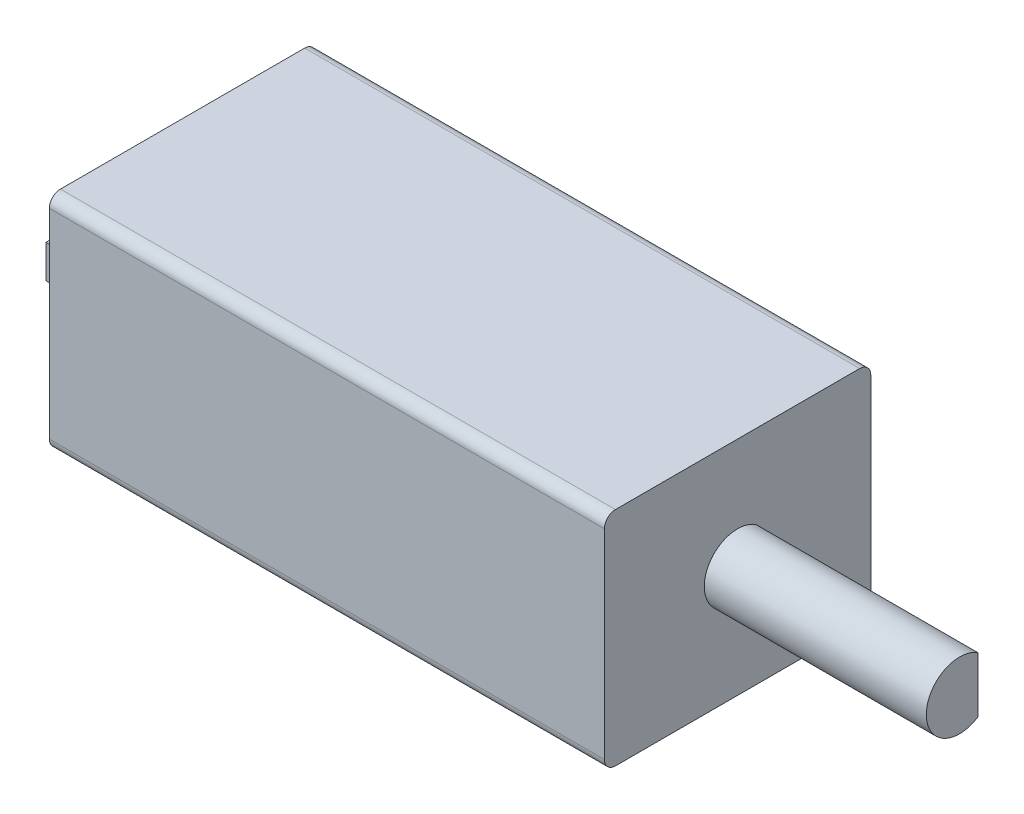
ISO-10303-21;
HEADER;
FILE_DESCRIPTION(('STEP AP214'),'2;1');
FILE_NAME('part.step','',(''),(''),'','','');
FILE_SCHEMA(('AUTOMOTIVE_DESIGN { 1 0 10303 214 1 1 1 1 }'));
ENDSEC;
DATA;
#1=APPLICATION_CONTEXT('core data for automotive mechanical design processes');
#2=APPLICATION_PROTOCOL_DEFINITION('international standard','automotive_design',2000,#1);
#3=PRODUCT_CONTEXT('',#1,'mechanical');
#4=PRODUCT('Part','Part','',(#3));
#5=PRODUCT_RELATED_PRODUCT_CATEGORY('part','',(#4));
#6=PRODUCT_DEFINITION_FORMATION('','',#4);
#7=PRODUCT_DEFINITION_CONTEXT('part definition',#1,'design');
#8=PRODUCT_DEFINITION('design','',#6,#7);
#9=PRODUCT_DEFINITION_SHAPE('','',#8);
#10=(LENGTH_UNIT() NAMED_UNIT(*) SI_UNIT(.MILLI.,.METRE.));
#11=(NAMED_UNIT(*) PLANE_ANGLE_UNIT() SI_UNIT($,.RADIAN.));
#12=(NAMED_UNIT(*) SI_UNIT($,.STERADIAN.) SOLID_ANGLE_UNIT());
#13=UNCERTAINTY_MEASURE_WITH_UNIT(LENGTH_MEASURE(1.E-05),#10,'distance_accuracy_value','');
#14=(GEOMETRIC_REPRESENTATION_CONTEXT(3) GLOBAL_UNCERTAINTY_ASSIGNED_CONTEXT((#13)) GLOBAL_UNIT_ASSIGNED_CONTEXT((#10,
#11,#12)) REPRESENTATION_CONTEXT('',''));
#15=CARTESIAN_POINT('',(0.,0.,0.));
#16=DIRECTION('',(0.,0.,1.));
#17=DIRECTION('',(1.,0.,0.));
#18=AXIS2_PLACEMENT_3D('',#15,#16,#17);
#19=CARTESIAN_POINT('',(0.,4.5,-5.5));
#20=DIRECTION('',(1.,0.,0.));
#21=DIRECTION('',(0.,0.,-1.));
#22=AXIS2_PLACEMENT_3D('',#19,#20,#21);
#23=PLANE('',#22);
#24=DIRECTION('',(0.,-1.,0.));
#25=VECTOR('',#24,1.);
#26=CARTESIAN_POINT('',(0.,0.749999999999999,-3.65));
#27=LINE('',#26,#25);
#28=CARTESIAN_POINT('',(0.,0.749999999999999,-3.65));
#29=VERTEX_POINT('',#28);
#30=CARTESIAN_POINT('',(0.,-0.750000000000001,-3.65));
#31=VERTEX_POINT('',#30);
#32=EDGE_CURVE('E180',#29,#31,#27,.T.);
#33=ORIENTED_EDGE('',*,*,#32,.F.);
#34=DIRECTION('',(0.,0.,1.));
#35=VECTOR('',#34,1.);
#36=CARTESIAN_POINT('',(0.,0.749999999999999,-3.65));
#37=LINE('',#36,#35);
#38=CARTESIAN_POINT('',(0.,0.749999999999999,-3.35));
#39=VERTEX_POINT('',#38);
#40=EDGE_CURVE('E188',#29,#39,#37,.T.);
#41=ORIENTED_EDGE('',*,*,#40,.T.);
#42=DIRECTION('',(0.,-1.,0.));
#43=VECTOR('',#42,1.);
#44=CARTESIAN_POINT('',(0.,0.749999999999999,-3.35));
#45=LINE('',#44,#43);
#46=CARTESIAN_POINT('',(0.,-0.750000000000002,-3.35));
#47=VERTEX_POINT('',#46);
#48=EDGE_CURVE('E195',#39,#47,#45,.T.);
#49=ORIENTED_EDGE('',*,*,#48,.T.);
#50=DIRECTION('',(0.,0.,1.));
#51=VECTOR('',#50,1.);
#52=CARTESIAN_POINT('',(0.,-0.750000000000001,-3.65));
#53=LINE('',#52,#51);
#54=EDGE_CURVE('E64',#31,#47,#53,.T.);
#55=ORIENTED_EDGE('',*,*,#54,.F.);
#56=EDGE_LOOP('',(#33,#41,#49,#55));
#57=FACE_BOUND('',#56,.T.);
#58=CARTESIAN_POINT('',(0.,4.5,-5.5));
#59=DIRECTION('',(1.,0.,0.));
#60=DIRECTION('',(0.,0.,-1.));
#61=AXIS2_PLACEMENT_3D('',#58,#59,#60);
#62=CIRCLE('',#61,0.5);
#63=CARTESIAN_POINT('',(0.,4.5,-6.));
#64=VERTEX_POINT('',#63);
#65=CARTESIAN_POINT('',(0.,5.,-5.5));
#66=VERTEX_POINT('',#65);
#67=EDGE_CURVE('E254',#64,#66,#62,.T.);
#68=ORIENTED_EDGE('',*,*,#67,.F.);
#69=DIRECTION('',(0.,1.,0.));
#70=VECTOR('',#69,1.);
#71=CARTESIAN_POINT('',(0.,4.5,-6.));
#72=LINE('',#71,#70);
#73=CARTESIAN_POINT('',(0.,-4.5,-6.));
#74=VERTEX_POINT('',#73);
#75=EDGE_CURVE('E259',#74,#64,#72,.T.);
#76=ORIENTED_EDGE('',*,*,#75,.F.);
#77=CARTESIAN_POINT('',(0.,-4.5,-5.5));
#78=DIRECTION('',(1.,0.,0.));
#79=DIRECTION('',(0.,0.,-1.));
#80=AXIS2_PLACEMENT_3D('',#77,#78,#79);
#81=CIRCLE('',#80,0.5);
#82=CARTESIAN_POINT('',(0.,-5.,-5.5));
#83=VERTEX_POINT('',#82);
#84=EDGE_CURVE('E286',#83,#74,#81,.T.);
#85=ORIENTED_EDGE('',*,*,#84,.F.);
#86=DIRECTION('',(0.,0.,-1.));
#87=VECTOR('',#86,1.);
#88=CARTESIAN_POINT('',(0.,-5.,5.5));
#89=LINE('',#88,#87);
#90=CARTESIAN_POINT('',(0.,-5.,5.5));
#91=VERTEX_POINT('',#90);
#92=EDGE_CURVE('E284',#91,#83,#89,.T.);
#93=ORIENTED_EDGE('',*,*,#92,.F.);
#94=CARTESIAN_POINT('',(0.,-4.5,5.5));
#95=DIRECTION('',(1.,0.,0.));
#96=DIRECTION('',(0.,0.,-1.));
#97=AXIS2_PLACEMENT_3D('',#94,#95,#96);
#98=CIRCLE('',#97,0.5);
#99=CARTESIAN_POINT('',(0.,-4.5,6.));
#100=VERTEX_POINT('',#99);
#101=EDGE_CURVE('E282',#100,#91,#98,.T.);
#102=ORIENTED_EDGE('',*,*,#101,.F.);
#103=DIRECTION('',(0.,-1.,0.));
#104=VECTOR('',#103,1.);
#105=CARTESIAN_POINT('',(0.,4.5,6.));
#106=LINE('',#105,#104);
#107=CARTESIAN_POINT('',(0.,4.5,6.));
#108=VERTEX_POINT('',#107);
#109=EDGE_CURVE('E280',#108,#100,#106,.T.);
#110=ORIENTED_EDGE('',*,*,#109,.F.);
#111=CARTESIAN_POINT('',(0.,4.5,5.5));
#112=DIRECTION('',(1.,0.,0.));
#113=DIRECTION('',(0.,0.,1.));
#114=AXIS2_PLACEMENT_3D('',#111,#112,#113);
#115=CIRCLE('',#114,0.5);
#116=CARTESIAN_POINT('',(0.,5.,5.5));
#117=VERTEX_POINT('',#116);
#118=EDGE_CURVE('E278',#117,#108,#115,.T.);
#119=ORIENTED_EDGE('',*,*,#118,.F.);
#120=DIRECTION('',(0.,0.,1.));
#121=VECTOR('',#120,1.);
#122=CARTESIAN_POINT('',(0.,5.,5.5));
#123=LINE('',#122,#121);
#124=EDGE_CURVE('E276',#66,#117,#123,.T.);
#125=ORIENTED_EDGE('',*,*,#124,.F.);
#126=EDGE_LOOP('',(#68,#76,#85,#93,#102,#110,#119,#125));
#127=FACE_BOUND('',#126,.T.);
#128=DIRECTION('',(0.,0.,-1.));
#129=VECTOR('',#128,1.);
#130=CARTESIAN_POINT('',(0.,0.749999999999999,3.65));
#131=LINE('',#130,#129);
#132=CARTESIAN_POINT('',(0.,0.749999999999999,3.65));
#133=VERTEX_POINT('',#132);
#134=CARTESIAN_POINT('',(0.,0.749999999999999,3.35));
#135=VERTEX_POINT('',#134);
#136=EDGE_CURVE('E194',#133,#135,#131,.T.);
#137=ORIENTED_EDGE('',*,*,#136,.F.);
#138=DIRECTION('',(0.,-1.,0.));
#139=VECTOR('',#138,1.);
#140=CARTESIAN_POINT('',(0.,0.749999999999999,3.65));
#141=LINE('',#140,#139);
#142=CARTESIAN_POINT('',(0.,-0.750000000000002,3.65));
#143=VERTEX_POINT('',#142);
#144=EDGE_CURVE('E215',#133,#143,#141,.T.);
#145=ORIENTED_EDGE('',*,*,#144,.T.);
#146=DIRECTION('',(0.,0.,-1.));
#147=VECTOR('',#146,1.);
#148=CARTESIAN_POINT('',(0.,-0.750000000000001,3.65));
#149=LINE('',#148,#147);
#150=CARTESIAN_POINT('',(0.,-0.750000000000001,3.35));
#151=VERTEX_POINT('',#150);
#152=EDGE_CURVE('E72',#143,#151,#149,.T.);
#153=ORIENTED_EDGE('',*,*,#152,.T.);
#154=DIRECTION('',(0.,-1.,0.));
#155=VECTOR('',#154,1.);
#156=CARTESIAN_POINT('',(0.,0.749999999999999,3.35));
#157=LINE('',#156,#155);
#158=EDGE_CURVE('E226',#135,#151,#157,.T.);
#159=ORIENTED_EDGE('',*,*,#158,.F.);
#160=EDGE_LOOP('',(#137,#145,#153,#159));
#161=FACE_BOUND('',#160,.T.);
#162=ADVANCED_FACE('F49',(#57,#127,#161),#23,.F.);
#163=CARTESIAN_POINT('',(25.,4.5,-5.5));
#164=DIRECTION('',(1.,0.,0.));
#165=DIRECTION('',(0.,0.,-1.));
#166=AXIS2_PLACEMENT_3D('',#163,#164,#165);
#167=PLANE('',#166);
#168=CARTESIAN_POINT('',(25.,4.5,-5.5));
#169=DIRECTION('',(1.,0.,0.));
#170=DIRECTION('',(0.,0.,-1.));
#171=AXIS2_PLACEMENT_3D('',#168,#169,#170);
#172=CIRCLE('',#171,0.5);
#173=CARTESIAN_POINT('',(25.,4.5,-6.));
#174=VERTEX_POINT('',#173);
#175=CARTESIAN_POINT('',(25.,5.,-5.5));
#176=VERTEX_POINT('',#175);
#177=EDGE_CURVE('E255',#174,#176,#172,.T.);
#178=ORIENTED_EDGE('',*,*,#177,.T.);
#179=DIRECTION('',(0.,0.,1.));
#180=VECTOR('',#179,1.);
#181=CARTESIAN_POINT('',(25.,5.,5.5));
#182=LINE('',#181,#180);
#183=CARTESIAN_POINT('',(25.,5.,5.5));
#184=VERTEX_POINT('',#183);
#185=EDGE_CURVE('E258',#176,#184,#182,.T.);
#186=ORIENTED_EDGE('',*,*,#185,.T.);
#187=CARTESIAN_POINT('',(25.,4.5,5.5));
#188=DIRECTION('',(1.,0.,0.));
#189=DIRECTION('',(0.,0.,1.));
#190=AXIS2_PLACEMENT_3D('',#187,#188,#189);
#191=CIRCLE('',#190,0.5);
#192=CARTESIAN_POINT('',(25.,4.5,6.));
#193=VERTEX_POINT('',#192);
#194=EDGE_CURVE('E261',#184,#193,#191,.T.);
#195=ORIENTED_EDGE('',*,*,#194,.T.);
#196=DIRECTION('',(0.,-1.,0.));
#197=VECTOR('',#196,1.);
#198=CARTESIAN_POINT('',(25.,4.5,6.));
#199=LINE('',#198,#197);
#200=CARTESIAN_POINT('',(25.,-4.5,6.));
#201=VERTEX_POINT('',#200);
#202=EDGE_CURVE('E263',#193,#201,#199,.T.);
#203=ORIENTED_EDGE('',*,*,#202,.T.);
#204=CARTESIAN_POINT('',(25.,-4.5,5.5));
#205=DIRECTION('',(1.,0.,0.));
#206=DIRECTION('',(0.,0.,-1.));
#207=AXIS2_PLACEMENT_3D('',#204,#205,#206);
#208=CIRCLE('',#207,0.5);
#209=CARTESIAN_POINT('',(25.,-5.,5.5));
#210=VERTEX_POINT('',#209);
#211=EDGE_CURVE('E265',#201,#210,#208,.T.);
#212=ORIENTED_EDGE('',*,*,#211,.T.);
#213=DIRECTION('',(0.,0.,-1.));
#214=VECTOR('',#213,1.);
#215=CARTESIAN_POINT('',(25.,-5.,5.5));
#216=LINE('',#215,#214);
#217=CARTESIAN_POINT('',(25.,-5.,-5.5));
#218=VERTEX_POINT('',#217);
#219=EDGE_CURVE('E267',#210,#218,#216,.T.);
#220=ORIENTED_EDGE('',*,*,#219,.T.);
#221=CARTESIAN_POINT('',(25.,-4.5,-5.5));
#222=DIRECTION('',(1.,0.,0.));
#223=DIRECTION('',(0.,0.,-1.));
#224=AXIS2_PLACEMENT_3D('',#221,#222,#223);
#225=CIRCLE('',#224,0.5);
#226=CARTESIAN_POINT('',(25.,-4.5,-6.));
#227=VERTEX_POINT('',#226);
#228=EDGE_CURVE('E269',#218,#227,#225,.T.);
#229=ORIENTED_EDGE('',*,*,#228,.T.);
#230=DIRECTION('',(0.,1.,0.));
#231=VECTOR('',#230,1.);
#232=CARTESIAN_POINT('',(25.,4.5,-6.));
#233=LINE('',#232,#231);
#234=EDGE_CURVE('E271',#227,#174,#233,.T.);
#235=ORIENTED_EDGE('',*,*,#234,.T.);
#236=EDGE_LOOP('',(#178,#186,#195,#203,#212,#220,#229,#235));
#237=FACE_BOUND('',#236,.T.);
#238=DIRECTION('',(0.,1.,0.));
#239=VECTOR('',#238,1.);
#240=CARTESIAN_POINT('',(25.,0.,-0.82915619758885));
#241=LINE('',#240,#239);
#242=CARTESIAN_POINT('',(25.,-1.25,-0.82915619758885));
#243=VERTEX_POINT('',#242);
#244=CARTESIAN_POINT('',(25.,1.25,-0.82915619758885));
#245=VERTEX_POINT('',#244);
#246=EDGE_CURVE('E244',#243,#245,#241,.T.);
#247=ORIENTED_EDGE('',*,*,#246,.F.);
#248=CARTESIAN_POINT('',(25.,0.,0.));
#249=DIRECTION('',(1.,0.,0.));
#250=DIRECTION('',(0.,0.,-1.));
#251=AXIS2_PLACEMENT_3D('',#248,#249,#250);
#252=CIRCLE('',#251,1.5);
#253=EDGE_CURVE('E239',#245,#243,#252,.T.);
#254=ORIENTED_EDGE('',*,*,#253,.F.);
#255=EDGE_LOOP('',(#247,#254));
#256=FACE_BOUND('',#255,.T.);
#257=ADVANCED_FACE('F328',(#237,#256),#167,.T.);
#258=CARTESIAN_POINT('',(25.,4.5,-5.5));
#259=DIRECTION('',(-1.,0.,0.));
#260=DIRECTION('',(0.,0.,1.));
#261=AXIS2_PLACEMENT_3D('',#258,#259,#260);
#262=CYLINDRICAL_SURFACE('',#261,0.5);
#263=ORIENTED_EDGE('',*,*,#67,.T.);
#264=DIRECTION('',(-1.,0.,0.));
#265=VECTOR('',#264,1.);
#266=CARTESIAN_POINT('',(25.,5.,-5.5));
#267=LINE('',#266,#265);
#268=EDGE_CURVE('E13',#176,#66,#267,.T.);
#269=ORIENTED_EDGE('',*,*,#268,.F.);
#270=ORIENTED_EDGE('',*,*,#177,.F.);
#271=DIRECTION('',(-1.,0.,0.));
#272=VECTOR('',#271,1.);
#273=CARTESIAN_POINT('',(25.,4.5,-6.));
#274=LINE('',#273,#272);
#275=EDGE_CURVE('E273',#174,#64,#274,.T.);
#276=ORIENTED_EDGE('',*,*,#275,.T.);
#277=EDGE_LOOP('',(#263,#269,#270,#276));
#278=FACE_BOUND('',#277,.T.);
#279=ADVANCED_FACE('F51',(#278),#262,.T.);
#280=CARTESIAN_POINT('',(25.,5.,5.5));
#281=DIRECTION('',(0.,-1.,0.));
#282=DIRECTION('',(0.,0.,-1.));
#283=AXIS2_PLACEMENT_3D('',#280,#281,#282);
#284=PLANE('',#283);
#285=ORIENTED_EDGE('',*,*,#124,.T.);
#286=DIRECTION('',(-1.,0.,0.));
#287=VECTOR('',#286,1.);
#288=CARTESIAN_POINT('',(25.,5.,5.5));
#289=LINE('',#288,#287);
#290=EDGE_CURVE('E57',#184,#117,#289,.T.);
#291=ORIENTED_EDGE('',*,*,#290,.F.);
#292=ORIENTED_EDGE('',*,*,#185,.F.);
#293=ORIENTED_EDGE('',*,*,#268,.T.);
#294=EDGE_LOOP('',(#285,#291,#292,#293));
#295=FACE_BOUND('',#294,.T.);
#296=ADVANCED_FACE('F333',(#295),#284,.F.);
#297=CARTESIAN_POINT('',(25.,4.5,5.5));
#298=DIRECTION('',(-1.,0.,0.));
#299=DIRECTION('',(0.,0.,1.));
#300=AXIS2_PLACEMENT_3D('',#297,#298,#299);
#301=CYLINDRICAL_SURFACE('',#300,0.5);
#302=ORIENTED_EDGE('',*,*,#118,.T.);
#303=DIRECTION('',(-1.,0.,0.));
#304=VECTOR('',#303,1.);
#305=CARTESIAN_POINT('',(25.,4.5,6.));
#306=LINE('',#305,#304);
#307=EDGE_CURVE('E303',#193,#108,#306,.T.);
#308=ORIENTED_EDGE('',*,*,#307,.F.);
#309=ORIENTED_EDGE('',*,*,#194,.F.);
#310=ORIENTED_EDGE('',*,*,#290,.T.);
#311=EDGE_LOOP('',(#302,#308,#309,#310));
#312=FACE_BOUND('',#311,.T.);
#313=ADVANCED_FACE('F310',(#312),#301,.T.);
#314=CARTESIAN_POINT('',(25.,4.5,6.));
#315=DIRECTION('',(0.,0.,-1.));
#316=DIRECTION('',(0.,1.,0.));
#317=AXIS2_PLACEMENT_3D('',#314,#315,#316);
#318=PLANE('',#317);
#319=ORIENTED_EDGE('',*,*,#109,.T.);
#320=DIRECTION('',(-1.,0.,0.));
#321=VECTOR('',#320,1.);
#322=CARTESIAN_POINT('',(25.,-4.5,6.));
#323=LINE('',#322,#321);
#324=EDGE_CURVE('E300',#201,#100,#323,.T.);
#325=ORIENTED_EDGE('',*,*,#324,.F.);
#326=ORIENTED_EDGE('',*,*,#202,.F.);
#327=ORIENTED_EDGE('',*,*,#307,.T.);
#328=EDGE_LOOP('',(#319,#325,#326,#327));
#329=FACE_BOUND('',#328,.T.);
#330=ADVANCED_FACE('F320',(#329),#318,.F.);
#331=CARTESIAN_POINT('',(25.,-4.5,5.5));
#332=DIRECTION('',(-1.,0.,0.));
#333=DIRECTION('',(0.,0.,1.));
#334=AXIS2_PLACEMENT_3D('',#331,#332,#333);
#335=CYLINDRICAL_SURFACE('',#334,0.5);
#336=ORIENTED_EDGE('',*,*,#101,.T.);
#337=DIRECTION('',(-1.,0.,0.));
#338=VECTOR('',#337,1.);
#339=CARTESIAN_POINT('',(25.,-5.,5.5));
#340=LINE('',#339,#338);
#341=EDGE_CURVE('E297',#210,#91,#340,.T.);
#342=ORIENTED_EDGE('',*,*,#341,.F.);
#343=ORIENTED_EDGE('',*,*,#211,.F.);
#344=ORIENTED_EDGE('',*,*,#324,.T.);
#345=EDGE_LOOP('',(#336,#342,#343,#344));
#346=FACE_BOUND('',#345,.T.);
#347=ADVANCED_FACE('F324',(#346),#335,.T.);
#348=CARTESIAN_POINT('',(25.,-5.,5.5));
#349=DIRECTION('',(0.,1.,0.));
#350=DIRECTION('',(0.,0.,1.));
#351=AXIS2_PLACEMENT_3D('',#348,#349,#350);
#352=PLANE('',#351);
#353=ORIENTED_EDGE('',*,*,#92,.T.);
#354=DIRECTION('',(-1.,0.,0.));
#355=VECTOR('',#354,1.);
#356=CARTESIAN_POINT('',(25.,-5.,-5.5));
#357=LINE('',#356,#355);
#358=EDGE_CURVE('E294',#218,#83,#357,.T.);
#359=ORIENTED_EDGE('',*,*,#358,.F.);
#360=ORIENTED_EDGE('',*,*,#219,.F.);
#361=ORIENTED_EDGE('',*,*,#341,.T.);
#362=EDGE_LOOP('',(#353,#359,#360,#361));
#363=FACE_BOUND('',#362,.T.);
#364=ADVANCED_FACE('F346',(#363),#352,.F.);
#365=CARTESIAN_POINT('',(25.,-4.5,-5.5));
#366=DIRECTION('',(-1.,0.,0.));
#367=DIRECTION('',(0.,0.,1.));
#368=AXIS2_PLACEMENT_3D('',#365,#366,#367);
#369=CYLINDRICAL_SURFACE('',#368,0.5);
#370=ORIENTED_EDGE('',*,*,#84,.T.);
#371=DIRECTION('',(-1.,0.,0.));
#372=VECTOR('',#371,1.);
#373=CARTESIAN_POINT('',(25.,-4.5,-6.));
#374=LINE('',#373,#372);
#375=EDGE_CURVE('E291',#227,#74,#374,.T.);
#376=ORIENTED_EDGE('',*,*,#375,.F.);
#377=ORIENTED_EDGE('',*,*,#228,.F.);
#378=ORIENTED_EDGE('',*,*,#358,.T.);
#379=EDGE_LOOP('',(#370,#376,#377,#378));
#380=FACE_BOUND('',#379,.T.);
#381=ADVANCED_FACE('F344',(#380),#369,.T.);
#382=CARTESIAN_POINT('',(25.,4.5,-6.));
#383=DIRECTION('',(0.,0.,1.));
#384=DIRECTION('',(0.,-1.,0.));
#385=AXIS2_PLACEMENT_3D('',#382,#383,#384);
#386=PLANE('',#385);
#387=ORIENTED_EDGE('',*,*,#75,.T.);
#388=ORIENTED_EDGE('',*,*,#275,.F.);
#389=ORIENTED_EDGE('',*,*,#234,.F.);
#390=ORIENTED_EDGE('',*,*,#375,.T.);
#391=EDGE_LOOP('',(#387,#388,#389,#390));
#392=FACE_BOUND('',#391,.T.);
#393=ADVANCED_FACE('F339',(#392),#386,.F.);
#394=CARTESIAN_POINT('',(35.,0.,0.));
#395=DIRECTION('',(-1.,0.,0.));
#396=DIRECTION('',(0.,0.,1.));
#397=AXIS2_PLACEMENT_3D('',#394,#395,#396);
#398=CYLINDRICAL_SURFACE('',#397,1.5);
#399=ORIENTED_EDGE('',*,*,#253,.T.);
#400=DIRECTION('',(-1.,0.,0.));
#401=VECTOR('',#400,1.);
#402=CARTESIAN_POINT('',(35.,-1.25,-0.82915619758885));
#403=LINE('',#402,#401);
#404=CARTESIAN_POINT('',(35.,-1.25,-0.82915619758885));
#405=VERTEX_POINT('',#404);
#406=EDGE_CURVE('E251',#405,#243,#403,.T.);
#407=ORIENTED_EDGE('',*,*,#406,.F.);
#408=CARTESIAN_POINT('',(35.,0.,0.));
#409=DIRECTION('',(1.,0.,0.));
#410=DIRECTION('',(0.,0.,-1.));
#411=AXIS2_PLACEMENT_3D('',#408,#409,#410);
#412=CIRCLE('',#411,1.5);
#413=CARTESIAN_POINT('',(35.,1.25,-0.82915619758885));
#414=VERTEX_POINT('',#413);
#415=EDGE_CURVE('E240',#414,#405,#412,.T.);
#416=ORIENTED_EDGE('',*,*,#415,.F.);
#417=DIRECTION('',(-1.,0.,0.));
#418=VECTOR('',#417,1.);
#419=CARTESIAN_POINT('',(35.,1.25,-0.82915619758885));
#420=LINE('',#419,#418);
#421=EDGE_CURVE('E246',#414,#245,#420,.T.);
#422=ORIENTED_EDGE('',*,*,#421,.T.);
#423=EDGE_LOOP('',(#399,#407,#416,#422));
#424=FACE_BOUND('',#423,.T.);
#425=ADVANCED_FACE('F364',(#424),#398,.T.);
#426=CARTESIAN_POINT('',(35.,0.,-0.82915619758885));
#427=DIRECTION('',(0.,0.,1.));
#428=DIRECTION('',(1.,0.,0.));
#429=AXIS2_PLACEMENT_3D('',#426,#427,#428);
#430=PLANE('',#429);
#431=ORIENTED_EDGE('',*,*,#246,.T.);
#432=ORIENTED_EDGE('',*,*,#421,.F.);
#433=DIRECTION('',(0.,1.,0.));
#434=VECTOR('',#433,1.);
#435=CARTESIAN_POINT('',(35.,0.,-0.82915619758885));
#436=LINE('',#435,#434);
#437=EDGE_CURVE('E243',#405,#414,#436,.T.);
#438=ORIENTED_EDGE('',*,*,#437,.F.);
#439=ORIENTED_EDGE('',*,*,#406,.T.);
#440=EDGE_LOOP('',(#431,#432,#438,#439));
#441=FACE_BOUND('',#440,.T.);
#442=ADVANCED_FACE('F368',(#441),#430,.F.);
#443=CARTESIAN_POINT('',(35.,0.,0.));
#444=DIRECTION('',(1.,0.,0.));
#445=DIRECTION('',(0.,0.,-1.));
#446=AXIS2_PLACEMENT_3D('',#443,#444,#445);
#447=PLANE('',#446);
#448=ORIENTED_EDGE('',*,*,#415,.T.);
#449=ORIENTED_EDGE('',*,*,#437,.T.);
#450=EDGE_LOOP('',(#448,#449));
#451=FACE_BOUND('',#450,.T.);
#452=ADVANCED_FACE('F373',(#451),#447,.T.);
#453=CARTESIAN_POINT('',(-2.5,0.749999999999999,3.65));
#454=DIRECTION('',(0.,-1.,0.));
#455=DIRECTION('',(0.,0.,-1.));
#456=AXIS2_PLACEMENT_3D('',#453,#454,#455);
#457=PLANE('',#456);
#458=ORIENTED_EDGE('',*,*,#136,.T.);
#459=DIRECTION('',(1.,0.,0.));
#460=VECTOR('',#459,1.);
#461=CARTESIAN_POINT('',(-2.5,0.749999999999999,3.35));
#462=LINE('',#461,#460);
#463=CARTESIAN_POINT('',(-2.5,0.749999999999999,3.35));
#464=VERTEX_POINT('',#463);
#465=EDGE_CURVE('E237',#464,#135,#462,.T.);
#466=ORIENTED_EDGE('',*,*,#465,.F.);
#467=DIRECTION('',(0.,0.,-1.));
#468=VECTOR('',#467,1.);
#469=CARTESIAN_POINT('',(-2.5,0.749999999999999,3.65));
#470=LINE('',#469,#468);
#471=CARTESIAN_POINT('',(-2.5,0.749999999999999,3.65));
#472=VERTEX_POINT('',#471);
#473=EDGE_CURVE('E211',#472,#464,#470,.T.);
#474=ORIENTED_EDGE('',*,*,#473,.F.);
#475=DIRECTION('',(1.,0.,0.));
#476=VECTOR('',#475,1.);
#477=CARTESIAN_POINT('',(-2.5,0.749999999999999,3.65));
#478=LINE('',#477,#476);
#479=EDGE_CURVE('E223',#472,#133,#478,.T.);
#480=ORIENTED_EDGE('',*,*,#479,.T.);
#481=EDGE_LOOP('',(#458,#466,#474,#480));
#482=FACE_BOUND('',#481,.T.);
#483=ADVANCED_FACE('F379',(#482),#457,.F.);
#484=CARTESIAN_POINT('',(-2.5,0.749999999999999,3.35));
#485=DIRECTION('',(0.,0.,1.));
#486=DIRECTION('',(0.,-1.,0.));
#487=AXIS2_PLACEMENT_3D('',#484,#485,#486);
#488=PLANE('',#487);
#489=ORIENTED_EDGE('',*,*,#158,.T.);
#490=DIRECTION('',(1.,0.,0.));
#491=VECTOR('',#490,1.);
#492=CARTESIAN_POINT('',(-2.5,-0.750000000000001,3.35));
#493=LINE('',#492,#491);
#494=CARTESIAN_POINT('',(-2.5,-0.750000000000001,3.35));
#495=VERTEX_POINT('',#494);
#496=EDGE_CURVE('E235',#495,#151,#493,.T.);
#497=ORIENTED_EDGE('',*,*,#496,.F.);
#498=DIRECTION('',(0.,-1.,0.));
#499=VECTOR('',#498,1.);
#500=CARTESIAN_POINT('',(-2.5,0.749999999999999,3.35));
#501=LINE('',#500,#499);
#502=EDGE_CURVE('E214',#464,#495,#501,.T.);
#503=ORIENTED_EDGE('',*,*,#502,.F.);
#504=ORIENTED_EDGE('',*,*,#465,.T.);
#505=EDGE_LOOP('',(#489,#497,#503,#504));
#506=FACE_BOUND('',#505,.T.);
#507=ADVANCED_FACE('F383',(#506),#488,.F.);
#508=CARTESIAN_POINT('',(-2.5,-0.750000000000001,3.65));
#509=DIRECTION('',(0.,-1.,0.));
#510=DIRECTION('',(0.,0.,-1.));
#511=AXIS2_PLACEMENT_3D('',#508,#509,#510);
#512=PLANE('',#511);
#513=ORIENTED_EDGE('',*,*,#152,.F.);
#514=DIRECTION('',(1.,0.,0.));
#515=VECTOR('',#514,1.);
#516=CARTESIAN_POINT('',(-2.5,-0.750000000000001,3.65));
#517=LINE('',#516,#515);
#518=CARTESIAN_POINT('',(-2.5,-0.750000000000001,3.65));
#519=VERTEX_POINT('',#518);
#520=EDGE_CURVE('E233',#519,#143,#517,.T.);
#521=ORIENTED_EDGE('',*,*,#520,.F.);
#522=DIRECTION('',(0.,0.,-1.));
#523=VECTOR('',#522,1.);
#524=CARTESIAN_POINT('',(-2.5,-0.750000000000001,3.65));
#525=LINE('',#524,#523);
#526=EDGE_CURVE('E217',#519,#495,#525,.T.);
#527=ORIENTED_EDGE('',*,*,#526,.T.);
#528=ORIENTED_EDGE('',*,*,#496,.T.);
#529=EDGE_LOOP('',(#513,#521,#527,#528));
#530=FACE_BOUND('',#529,.T.);
#531=ADVANCED_FACE('F387',(#530),#512,.T.);
#532=CARTESIAN_POINT('',(-2.5,0.749999999999999,3.65));
#533=DIRECTION('',(0.,0.,1.));
#534=DIRECTION('',(1.,0.,0.));
#535=AXIS2_PLACEMENT_3D('',#532,#533,#534);
#536=PLANE('',#535);
#537=ORIENTED_EDGE('',*,*,#144,.F.);
#538=ORIENTED_EDGE('',*,*,#479,.F.);
#539=DIRECTION('',(0.,-1.,0.));
#540=VECTOR('',#539,1.);
#541=CARTESIAN_POINT('',(-2.5,0.749999999999999,3.65));
#542=LINE('',#541,#540);
#543=EDGE_CURVE('E220',#472,#519,#542,.T.);
#544=ORIENTED_EDGE('',*,*,#543,.T.);
#545=ORIENTED_EDGE('',*,*,#520,.T.);
#546=EDGE_LOOP('',(#537,#538,#544,#545));
#547=FACE_BOUND('',#546,.T.);
#548=ADVANCED_FACE('F391',(#547),#536,.T.);
#549=CARTESIAN_POINT('',(-2.5,0.,0.));
#550=DIRECTION('',(-1.,0.,0.));
#551=DIRECTION('',(0.,0.,1.));
#552=AXIS2_PLACEMENT_3D('',#549,#550,#551);
#553=PLANE('',#552);
#554=ORIENTED_EDGE('',*,*,#473,.T.);
#555=ORIENTED_EDGE('',*,*,#502,.T.);
#556=ORIENTED_EDGE('',*,*,#526,.F.);
#557=ORIENTED_EDGE('',*,*,#543,.F.);
#558=EDGE_LOOP('',(#554,#555,#556,#557));
#559=FACE_BOUND('',#558,.T.);
#560=ADVANCED_FACE('F394',(#559),#553,.T.);
#561=CARTESIAN_POINT('',(-2.5,0.749999999999999,-3.65));
#562=DIRECTION('',(0.,1.,0.));
#563=DIRECTION('',(0.,0.,1.));
#564=AXIS2_PLACEMENT_3D('',#561,#562,#563);
#565=PLANE('',#564);
#566=ORIENTED_EDGE('',*,*,#40,.F.);
#567=DIRECTION('',(1.,0.,0.));
#568=VECTOR('',#567,1.);
#569=CARTESIAN_POINT('',(-2.5,0.749999999999999,-3.65));
#570=LINE('',#569,#568);
#571=CARTESIAN_POINT('',(-2.5,0.749999999999999,-3.65));
#572=VERTEX_POINT('',#571);
#573=EDGE_CURVE('E175',#572,#29,#570,.T.);
#574=ORIENTED_EDGE('',*,*,#573,.F.);
#575=DIRECTION('',(0.,0.,1.));
#576=VECTOR('',#575,1.);
#577=CARTESIAN_POINT('',(-2.5,0.749999999999999,-3.65));
#578=LINE('',#577,#576);
#579=CARTESIAN_POINT('',(-2.5,0.749999999999999,-3.35));
#580=VERTEX_POINT('',#579);
#581=EDGE_CURVE('E198',#572,#580,#578,.T.);
#582=ORIENTED_EDGE('',*,*,#581,.T.);
#583=DIRECTION('',(1.,0.,0.));
#584=VECTOR('',#583,1.);
#585=CARTESIAN_POINT('',(-2.5,0.749999999999999,-3.35));
#586=LINE('',#585,#584);
#587=EDGE_CURVE('E190',#580,#39,#586,.T.);
#588=ORIENTED_EDGE('',*,*,#587,.T.);
#589=EDGE_LOOP('',(#566,#574,#582,#588));
#590=FACE_BOUND('',#589,.T.);
#591=ADVANCED_FACE('F189',(#590),#565,.T.);
#592=CARTESIAN_POINT('',(-2.5,0.749999999999999,-3.65));
#593=DIRECTION('',(0.,0.,1.));
#594=DIRECTION('',(0.,-1.,0.));
#595=AXIS2_PLACEMENT_3D('',#592,#593,#594);
#596=PLANE('',#595);
#597=ORIENTED_EDGE('',*,*,#32,.T.);
#598=DIRECTION('',(1.,0.,0.));
#599=VECTOR('',#598,1.);
#600=CARTESIAN_POINT('',(-2.5,-0.750000000000001,-3.65));
#601=LINE('',#600,#599);
#602=CARTESIAN_POINT('',(-2.5,-0.750000000000001,-3.65));
#603=VERTEX_POINT('',#602);
#604=EDGE_CURVE('E185',#603,#31,#601,.T.);
#605=ORIENTED_EDGE('',*,*,#604,.F.);
#606=DIRECTION('',(0.,-1.,0.));
#607=VECTOR('',#606,1.);
#608=CARTESIAN_POINT('',(-2.5,0.749999999999999,-3.65));
#609=LINE('',#608,#607);
#610=EDGE_CURVE('E181',#572,#603,#609,.T.);
#611=ORIENTED_EDGE('',*,*,#610,.F.);
#612=ORIENTED_EDGE('',*,*,#573,.T.);
#613=EDGE_LOOP('',(#597,#605,#611,#612));
#614=FACE_BOUND('',#613,.T.);
#615=ADVANCED_FACE('F177',(#614),#596,.F.);
#616=CARTESIAN_POINT('',(-2.5,-0.750000000000001,-3.65));
#617=DIRECTION('',(0.,1.,0.));
#618=DIRECTION('',(0.,0.,1.));
#619=AXIS2_PLACEMENT_3D('',#616,#617,#618);
#620=PLANE('',#619);
#621=ORIENTED_EDGE('',*,*,#54,.T.);
#622=DIRECTION('',(1.,0.,0.));
#623=VECTOR('',#622,1.);
#624=CARTESIAN_POINT('',(-2.5,-0.750000000000001,-3.35));
#625=LINE('',#624,#623);
#626=CARTESIAN_POINT('',(-2.5,-0.750000000000001,-3.35));
#627=VERTEX_POINT('',#626);
#628=EDGE_CURVE('E553',#627,#47,#625,.T.);
#629=ORIENTED_EDGE('',*,*,#628,.F.);
#630=DIRECTION('',(0.,0.,1.));
#631=VECTOR('',#630,1.);
#632=CARTESIAN_POINT('',(-2.5,-0.750000000000001,-3.65));
#633=LINE('',#632,#631);
#634=EDGE_CURVE('E207',#603,#627,#633,.T.);
#635=ORIENTED_EDGE('',*,*,#634,.F.);
#636=ORIENTED_EDGE('',*,*,#604,.T.);
#637=EDGE_LOOP('',(#621,#629,#635,#636));
#638=FACE_BOUND('',#637,.T.);
#639=ADVANCED_FACE('F406',(#638),#620,.F.);
#640=CARTESIAN_POINT('',(-2.5,0.749999999999999,-3.35));
#641=DIRECTION('',(0.,0.,1.));
#642=DIRECTION('',(0.,-1.,0.));
#643=AXIS2_PLACEMENT_3D('',#640,#641,#642);
#644=PLANE('',#643);
#645=ORIENTED_EDGE('',*,*,#48,.F.);
#646=ORIENTED_EDGE('',*,*,#587,.F.);
#647=DIRECTION('',(0.,-1.,0.));
#648=VECTOR('',#647,1.);
#649=CARTESIAN_POINT('',(-2.5,0.749999999999999,-3.35));
#650=LINE('',#649,#648);
#651=EDGE_CURVE('E201',#580,#627,#650,.T.);
#652=ORIENTED_EDGE('',*,*,#651,.T.);
#653=ORIENTED_EDGE('',*,*,#628,.T.);
#654=EDGE_LOOP('',(#645,#646,#652,#653));
#655=FACE_BOUND('',#654,.T.);
#656=ADVANCED_FACE('F402',(#655),#644,.T.);
#657=CARTESIAN_POINT('',(-2.5,0.,0.));
#658=DIRECTION('',(1.,0.,0.));
#659=DIRECTION('',(0.,0.,-1.));
#660=AXIS2_PLACEMENT_3D('',#657,#658,#659);
#661=PLANE('',#660);
#662=ORIENTED_EDGE('',*,*,#581,.F.);
#663=ORIENTED_EDGE('',*,*,#610,.T.);
#664=ORIENTED_EDGE('',*,*,#634,.T.);
#665=ORIENTED_EDGE('',*,*,#651,.F.);
#666=EDGE_LOOP('',(#662,#663,#664,#665));
#667=FACE_BOUND('',#666,.T.);
#668=ADVANCED_FACE('F399',(#667),#661,.F.);
#669=CLOSED_SHELL('',(#162,#257,#279,#296,#313,#330,#347,#364,#381,#393,#425,#442,#452,#483,
#507,#531,#548,#560,#591,#615,#639,#656,#668));
#670=MANIFOLD_SOLID_BREP('B2',#669);
#671=ADVANCED_BREP_SHAPE_REPRESENTATION('',(#18,#670),#14);
#672=SHAPE_DEFINITION_REPRESENTATION(#9,#671);
ENDSEC;
END-ISO-10303-21;
